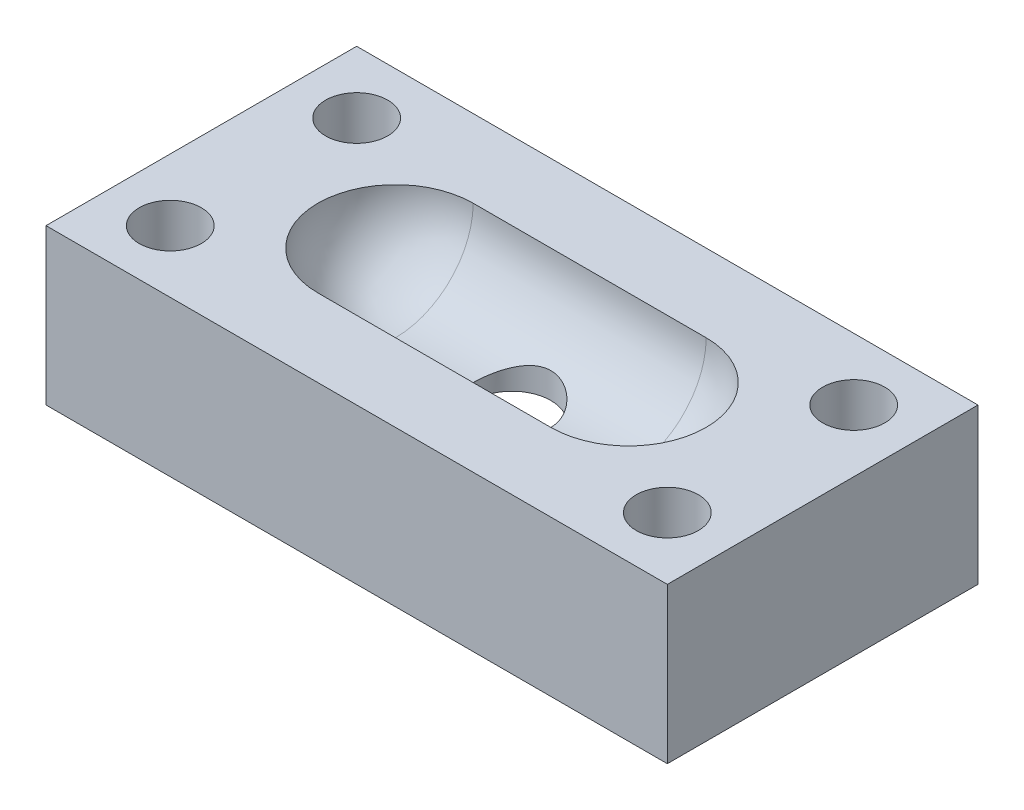
ISO-10303-21;
HEADER;
FILE_DESCRIPTION(('STEP AP214'),'2;1');
FILE_NAME('part.step','',(''),(''),'','','');
FILE_SCHEMA(('AUTOMOTIVE_DESIGN { 1 0 10303 214 1 1 1 1 }'));
ENDSEC;
DATA;
#1=APPLICATION_CONTEXT('core data for automotive mechanical design processes');
#2=APPLICATION_PROTOCOL_DEFINITION('international standard','automotive_design',2000,#1);
#3=PRODUCT_CONTEXT('',#1,'mechanical');
#4=PRODUCT('Part','Part','',(#3));
#5=PRODUCT_RELATED_PRODUCT_CATEGORY('part','',(#4));
#6=PRODUCT_DEFINITION_FORMATION('','',#4);
#7=PRODUCT_DEFINITION_CONTEXT('part definition',#1,'design');
#8=PRODUCT_DEFINITION('design','',#6,#7);
#9=PRODUCT_DEFINITION_SHAPE('','',#8);
#10=(LENGTH_UNIT() NAMED_UNIT(*) SI_UNIT(.MILLI.,.METRE.));
#11=(NAMED_UNIT(*) PLANE_ANGLE_UNIT() SI_UNIT($,.RADIAN.));
#12=(NAMED_UNIT(*) SI_UNIT($,.STERADIAN.) SOLID_ANGLE_UNIT());
#13=UNCERTAINTY_MEASURE_WITH_UNIT(LENGTH_MEASURE(1.E-05),#10,'distance_accuracy_value','');
#14=(GEOMETRIC_REPRESENTATION_CONTEXT(3) GLOBAL_UNCERTAINTY_ASSIGNED_CONTEXT((#13)) GLOBAL_UNIT_ASSIGNED_CONTEXT((#10,
#11,#12)) REPRESENTATION_CONTEXT('',''));
#15=CARTESIAN_POINT('',(0.,0.,0.));
#16=DIRECTION('',(0.,0.,1.));
#17=DIRECTION('',(1.,0.,0.));
#18=AXIS2_PLACEMENT_3D('',#15,#16,#17);
#19=CARTESIAN_POINT('',(0.,5.,0.));
#20=DIRECTION('',(0.,-1.,0.));
#21=DIRECTION('',(0.,0.,-1.));
#22=AXIS2_PLACEMENT_3D('',#19,#20,#21);
#23=CYLINDRICAL_SURFACE('',#22,2.5);
#24=CARTESIAN_POINT('',(0.,0.669872981077805,-2.5));
#25=CARTESIAN_POINT('',(0.130266506876492,0.669860177270082,-2.49998948436432));
#26=CARTESIAN_POINT('',(0.260702720676248,0.663904580344168,-2.48974954513168));
#27=CARTESIAN_POINT('',(0.517568971529232,0.640941229480926,-2.44930840724943));
#28=CARTESIAN_POINT('',(0.64399000405729,0.62391025273977,-2.41906526369544));
#29=CARTESIAN_POINT('',(0.888628945561066,0.581266231283411,-2.3402497699757));
#30=CARTESIAN_POINT('',(1.00688657356221,0.555698886610788,-2.29177485369963));
#31=CARTESIAN_POINT('',(1.23356056309455,0.498933408885443,-2.17816884056414));
#32=CARTESIAN_POINT('',(1.34197639179579,0.467734971241166,-2.11303684262671));
#33=CARTESIAN_POINT('',(1.55576430391692,0.400078264751489,-1.96166634317253));
#34=CARTESIAN_POINT('',(1.66014783448977,0.363398406684223,-1.87413008816917));
#35=CARTESIAN_POINT('',(1.8535209757132,0.290700432725469,-1.68313452122751));
#36=CARTESIAN_POINT('',(1.94250290775495,0.254682654872318,-1.57966731506051));
#37=CARTESIAN_POINT('',(2.10841787648564,0.184463075478651,-1.35122390789082));
#38=CARTESIAN_POINT('',(2.18413441927914,0.150547339359278,-1.22526797235894));
#39=CARTESIAN_POINT('',(2.31285213348386,0.0912310976980652,-0.960392566671144));
#40=CARTESIAN_POINT('',(2.3658676404385,0.0658252204546497,-0.82148134538998));
#41=CARTESIAN_POINT('',(2.44376165316397,0.0279884688493007,-0.54511235977352));
#42=CARTESIAN_POINT('',(2.47037381586513,0.014762994465746,-0.40825447621098));
#43=CARTESIAN_POINT('',(2.50041529671129,-0.000189596139728699,-0.131426571755674));
#44=CARTESIAN_POINT('',(2.50385864199536,-0.00192366961167925,0.00854151460651103));
#45=CARTESIAN_POINT('',(2.48813331506858,0.00592545208594663,0.274581311061967));
#46=CARTESIAN_POINT('',(2.47090496119546,0.0145376026952388,0.400802997942674));
#47=CARTESIAN_POINT('',(2.41779789023985,0.0406438685070626,0.648284429795112));
#48=CARTESIAN_POINT('',(2.38191777755984,0.0581386483403573,0.769543802734628));
#49=CARTESIAN_POINT('',(2.29229358477506,0.100710417808434,1.00577347892408));
#50=CARTESIAN_POINT('',(2.23830921706972,0.125888961769967,1.120633558788));
#51=CARTESIAN_POINT('',(2.11434145949638,0.181558850332876,1.33994200378327));
#52=CARTESIAN_POINT('',(2.04435234174416,0.212052096062912,1.4443866220966));
#53=CARTESIAN_POINT('',(1.88276162116743,0.278890140019253,1.6504341522455));
#54=CARTESIAN_POINT('',(1.78974242918497,0.315515600045618,1.75083518757341));
#55=CARTESIAN_POINT('',(1.58852568767457,0.388641485329714,1.93526092574445));
#56=CARTESIAN_POINT('',(1.48031656931485,0.425141793359282,2.01927302893558));
#57=CARTESIAN_POINT('',(1.24337951893978,0.496396097687884,2.17376333660553));
#58=CARTESIAN_POINT('',(1.11378494236447,0.530892000232312,2.24304328744513));
#59=CARTESIAN_POINT('',(0.842655821602504,0.590613743035605,2.35829778250308));
#60=CARTESIAN_POINT('',(0.701133917456093,0.615849248848317,2.40429664552723));
#61=CARTESIAN_POINT('',(0.421963721793025,0.651384104574142,2.4679505275626));
#62=CARTESIAN_POINT('',(0.284897202391127,0.66270860378759,2.48756280529994));
#63=CARTESIAN_POINT('',(0.00899664620863705,0.672052015959761,2.50379236652857));
#64=CARTESIAN_POINT('',(-0.129836072799497,0.67008032776721,2.50042589328757));
#65=CARTESIAN_POINT('',(-0.389134796446797,0.654141586485379,2.47259010835991));
#66=CARTESIAN_POINT('',(-0.509948627769731,0.641510312333648,2.45046954178116));
#67=CARTESIAN_POINT('',(-0.745919465677486,0.607649461216473,2.38924071158112));
#68=CARTESIAN_POINT('',(-0.861074626866852,0.586417099874153,2.35012694655908));
#69=CARTESIAN_POINT('',(-1.08852832725639,0.536594448008588,2.25411897151217));
#70=CARTESIAN_POINT('',(-1.20044754213256,0.507708918923429,2.19648515923163));
#71=CARTESIAN_POINT('',(-1.4136731788488,0.446097012568749,2.0657176600397));
#72=CARTESIAN_POINT('',(-1.51497410878814,0.413368666121276,1.99257601083123));
#73=CARTESIAN_POINT('',(-1.71744691880332,0.342800038591638,1.82209291799636));
#74=CARTESIAN_POINT('',(-1.81699287677222,0.304835421142924,1.72286318078435));
#75=CARTESIAN_POINT('',(-1.99853059500591,0.231644125552539,1.5085112384988));
#76=CARTESIAN_POINT('',(-2.08051642565855,0.196418374806708,1.39338368664988));
#77=CARTESIAN_POINT('',(-2.22643431479089,0.131465957726656,1.14633840638507));
#78=CARTESIAN_POINT('',(-2.28983279520846,0.10190895820145,1.01405774389062));
#79=CARTESIAN_POINT('',(-2.39284475996202,0.0529161260152968,0.738805911647332));
#80=CARTESIAN_POINT('',(-2.43247912960512,0.0334714080825393,0.595844253647067));
#81=CARTESIAN_POINT('',(-2.48342140935642,0.00831229546032039,0.317449205674706));
#82=CARTESIAN_POINT('',(-2.49699468583034,0.00150180232162231,0.182528609085377));
#83=CARTESIAN_POINT('',(-2.50210816749459,-0.00105325940467168,-0.0878149643374306));
#84=CARTESIAN_POINT('',(-2.49365608566108,0.00319829822958369,-0.223237748727016));
#85=CARTESIAN_POINT('',(-2.45645896960449,0.0216507791436313,-0.481344982671072));
#86=CARTESIAN_POINT('',(-2.42908782836368,0.0351776336319329,-0.604280801321772));
#87=CARTESIAN_POINT('',(-2.35668255024167,0.0701976580826903,-0.843614873664454));
#88=CARTESIAN_POINT('',(-2.31164588036637,0.0916919704448225,-0.960012187087213));
#89=CARTESIAN_POINT('',(-2.20318218126074,0.141851732585117,-1.18855854199593));
#90=CARTESIAN_POINT('',(-2.13905097531015,0.170784574931973,-1.30031295715363));
#91=CARTESIAN_POINT('',(-1.99510588985241,0.232796666550143,-1.51193650408535));
#92=CARTESIAN_POINT('',(-1.91528480737313,0.265877817708955,-1.61180014305397));
#93=CARTESIAN_POINT('',(-1.73300420555064,0.336784764490747,-1.80728542324369));
#94=CARTESIAN_POINT('',(-1.62908227399927,0.374755103416334,-1.90149582349002));
#95=CARTESIAN_POINT('',(-1.40638471461777,0.448423017150589,-2.07165660492503));
#96=CARTESIAN_POINT('',(-1.28759608580077,0.484118560894155,-2.1475908315154));
#97=CARTESIAN_POINT('',(-1.03336388233574,0.550010171760739,-2.28108393396028));
#98=CARTESIAN_POINT('',(-0.897512611575394,0.579996796530162,-2.33798627977449));
#99=CARTESIAN_POINT('',(-0.686777350480224,0.616297273399065,-2.40494911880459));
#100=CARTESIAN_POINT('',(-0.615440224302388,0.626945133539456,-2.42419582683991));
#101=CARTESIAN_POINT('',(-0.470959303150664,0.64492425829065,-2.45635087255788));
#102=CARTESIAN_POINT('',(-0.397816809045582,0.652257841457658,-2.46926364179176));
#103=CARTESIAN_POINT('',(-0.27049901345306,0.661762204570793,-2.48591166201423));
#104=CARTESIAN_POINT('',(-0.216583678487793,0.664795129752089,-2.49118864979202));
#105=CARTESIAN_POINT('',(-0.108455383689593,0.668853250886771,-2.49823512543933));
#106=CARTESIAN_POINT('',(-0.0542424041894476,0.669878312527387,-2.50000437866474));
#107=CARTESIAN_POINT('',(0.,0.669872981077805,-2.5));
#108=B_SPLINE_CURVE_WITH_KNOTS('',3,(#24,#25,#26,#27,#28,#29,#30,#31,#32,#33,#34,#35,#36,#37,
#38,#39,#40,#41,#42,#43,#44,#45,#46,#47,#48,#49,#50,#51,#52,#53,#54,#55,#56,#57,#58,#59,#60,#61,
#62,#63,#64,#65,#66,#67,#68,#69,#70,#71,#72,#73,#74,#75,#76,#77,#78,#79,#80,#81,#82,#83,#84,#85,
#86,#87,#88,#89,#90,#91,#92,#93,#94,#95,#96,#97,#98,#99,#100,#101,#102,#103,#104,#105,#106,
#107),.UNSPECIFIED.,.T.,.F.,(4,2,2,2,2,2,2,2,2,2,2,2,2,2,2,2,2,2,2,2,2,2,2,2,2,2,2,2,2,2,2,2,2,
2,2,2,2,2,2,2,2,4),(0.,0.390580306486789,0.781982232062012,1.17132148982692,1.56068181366371,
1.98215578129642,2.40383927716011,2.85394730601992,3.30377067414811,3.72158712424921,
4.13915059220183,4.52040243716429,4.90168281298721,5.2882383683295,5.67493248380763,
6.0981797864731,6.5217512061988,6.97222104328704,7.42221935534346,7.83655727140613,
8.25060232976016,8.61935458565147,8.98822631095241,9.37418241020302,9.76033715555202,
10.1951685895662,10.6301466245059,11.076604535375,11.5226694952701,11.927806759788,
12.3328021699001,12.7111106218381,13.0894733378512,13.4840187680376,13.8787457525688,
14.3127560463025,14.7471485711797,15.195268726016,15.4189244153949,15.6424233996907,
15.8050484542806,15.9676843870379),.UNSPECIFIED.);
#109=CARTESIAN_POINT('',(0.,0.669872981077805,-2.5));
#110=VERTEX_POINT('',#109);
#111=EDGE_CURVE('E171',#110,#110,#108,.T.);
#112=ORIENTED_EDGE('',*,*,#111,.F.);
#113=EDGE_LOOP('',(#112));
#114=FACE_BOUND('',#113,.T.);
#115=CARTESIAN_POINT('',(0.,-1.,0.));
#116=DIRECTION('',(0.,-1.,0.));
#117=DIRECTION('',(0.,0.,-1.));
#118=AXIS2_PLACEMENT_3D('',#115,#116,#117);
#119=CIRCLE('',#118,2.5);
#120=CARTESIAN_POINT('',(0.,-1.,-2.5));
#121=VERTEX_POINT('',#120);
#122=EDGE_CURVE('E159',#121,#121,#119,.T.);
#123=ORIENTED_EDGE('',*,*,#122,.T.);
#124=EDGE_LOOP('',(#123));
#125=FACE_BOUND('',#124,.T.);
#126=ADVANCED_FACE('F38',(#114,#125),#23,.F.);
#127=CARTESIAN_POINT('',(0.,5.,0.));
#128=DIRECTION('',(0.,-1.,0.));
#129=DIRECTION('',(0.,0.,-1.));
#130=AXIS2_PLACEMENT_3D('',#127,#128,#129);
#131=PLANE('',#130);
#132=DIRECTION('',(-1.,0.,0.));
#133=VECTOR('',#132,1.);
#134=CARTESIAN_POINT('',(-12.5,5.,5.));
#135=LINE('',#134,#133);
#136=CARTESIAN_POINT('',(7.5,5.,5.));
#137=VERTEX_POINT('',#136);
#138=CARTESIAN_POINT('',(-7.5,5.,5.));
#139=VERTEX_POINT('',#138);
#140=EDGE_CURVE('E176',#137,#139,#135,.T.);
#141=ORIENTED_EDGE('',*,*,#140,.T.);
#142=CARTESIAN_POINT('',(-7.5,5.,0.));
#143=DIRECTION('',(0.,-1.,0.));
#144=DIRECTION('',(0.,0.,-1.));
#145=AXIS2_PLACEMENT_3D('',#142,#143,#144);
#146=CIRCLE('',#145,5.);
#147=CARTESIAN_POINT('',(-7.5,5.,-5.));
#148=VERTEX_POINT('',#147);
#149=EDGE_CURVE('E435',#139,#148,#146,.T.);
#150=ORIENTED_EDGE('',*,*,#149,.T.);
#151=DIRECTION('',(-1.,0.,0.));
#152=VECTOR('',#151,1.);
#153=CARTESIAN_POINT('',(-12.5,5.,-5.));
#154=LINE('',#153,#152);
#155=CARTESIAN_POINT('',(7.5,5.,-5.));
#156=VERTEX_POINT('',#155);
#157=EDGE_CURVE('E172',#148,#156,#154,.F.);
#158=ORIENTED_EDGE('',*,*,#157,.T.);
#159=CARTESIAN_POINT('',(7.5,5.,0.));
#160=DIRECTION('',(0.,-1.,0.));
#161=DIRECTION('',(0.,0.,-1.));
#162=AXIS2_PLACEMENT_3D('',#159,#160,#161);
#163=CIRCLE('',#162,5.);
#164=EDGE_CURVE('E238',#156,#137,#163,.T.);
#165=ORIENTED_EDGE('',*,*,#164,.T.);
#166=EDGE_LOOP('',(#141,#150,#158,#165));
#167=FACE_BOUND('',#166,.T.);
#168=DIRECTION('',(0.,0.,-1.));
#169=VECTOR('',#168,1.);
#170=CARTESIAN_POINT('',(20.,5.,10.));
#171=LINE('',#170,#169);
#172=CARTESIAN_POINT('',(20.,5.,10.));
#173=VERTEX_POINT('',#172);
#174=CARTESIAN_POINT('',(20.,5.,-10.));
#175=VERTEX_POINT('',#174);
#176=EDGE_CURVE('E197',#173,#175,#171,.T.);
#177=ORIENTED_EDGE('',*,*,#176,.T.);
#178=DIRECTION('',(-1.,0.,0.));
#179=VECTOR('',#178,1.);
#180=CARTESIAN_POINT('',(-20.,5.,-10.));
#181=LINE('',#180,#179);
#182=CARTESIAN_POINT('',(-20.,5.,-10.));
#183=VERTEX_POINT('',#182);
#184=EDGE_CURVE('E201',#175,#183,#181,.T.);
#185=ORIENTED_EDGE('',*,*,#184,.T.);
#186=DIRECTION('',(0.,0.,1.));
#187=VECTOR('',#186,1.);
#188=CARTESIAN_POINT('',(-20.,5.,10.));
#189=LINE('',#188,#187);
#190=CARTESIAN_POINT('',(-20.,5.,10.));
#191=VERTEX_POINT('',#190);
#192=EDGE_CURVE('E205',#183,#191,#189,.T.);
#193=ORIENTED_EDGE('',*,*,#192,.T.);
#194=DIRECTION('',(1.,0.,0.));
#195=VECTOR('',#194,1.);
#196=CARTESIAN_POINT('',(-20.,5.,10.));
#197=LINE('',#196,#195);
#198=EDGE_CURVE('E208',#191,#173,#197,.T.);
#199=ORIENTED_EDGE('',*,*,#198,.T.);
#200=EDGE_LOOP('',(#177,#185,#193,#199));
#201=FACE_BOUND('',#200,.T.);
#202=CARTESIAN_POINT('',(-16.,5.,-6.));
#203=DIRECTION('',(0.,1.,0.));
#204=DIRECTION('',(0.,0.,1.));
#205=AXIS2_PLACEMENT_3D('',#202,#203,#204);
#206=CIRCLE('',#205,2.);
#207=CARTESIAN_POINT('',(-16.,5.,-4.));
#208=VERTEX_POINT('',#207);
#209=EDGE_CURVE('E192',#208,#208,#206,.T.);
#210=ORIENTED_EDGE('',*,*,#209,.F.);
#211=EDGE_LOOP('',(#210));
#212=FACE_BOUND('',#211,.T.);
#213=CARTESIAN_POINT('',(16.,5.,-6.));
#214=DIRECTION('',(0.,1.,0.));
#215=DIRECTION('',(0.,0.,1.));
#216=AXIS2_PLACEMENT_3D('',#213,#214,#215);
#217=CIRCLE('',#216,2.);
#218=CARTESIAN_POINT('',(16.,5.,-4.));
#219=VERTEX_POINT('',#218);
#220=EDGE_CURVE('E188',#219,#219,#217,.T.);
#221=ORIENTED_EDGE('',*,*,#220,.F.);
#222=EDGE_LOOP('',(#221));
#223=FACE_BOUND('',#222,.T.);
#224=CARTESIAN_POINT('',(16.,5.,6.));
#225=DIRECTION('',(0.,1.,0.));
#226=DIRECTION('',(0.,0.,1.));
#227=AXIS2_PLACEMENT_3D('',#224,#225,#226);
#228=CIRCLE('',#227,2.);
#229=CARTESIAN_POINT('',(16.,5.,8.));
#230=VERTEX_POINT('',#229);
#231=EDGE_CURVE('E184',#230,#230,#228,.T.);
#232=ORIENTED_EDGE('',*,*,#231,.F.);
#233=EDGE_LOOP('',(#232));
#234=FACE_BOUND('',#233,.T.);
#235=CARTESIAN_POINT('',(-16.,5.,6.));
#236=DIRECTION('',(0.,1.,0.));
#237=DIRECTION('',(0.,0.,1.));
#238=AXIS2_PLACEMENT_3D('',#235,#236,#237);
#239=CIRCLE('',#238,2.);
#240=CARTESIAN_POINT('',(-16.,5.,8.));
#241=VERTEX_POINT('',#240);
#242=EDGE_CURVE('E180',#241,#241,#239,.T.);
#243=ORIENTED_EDGE('',*,*,#242,.F.);
#244=EDGE_LOOP('',(#243));
#245=FACE_BOUND('',#244,.T.);
#246=ADVANCED_FACE('F272',(#167,#201,#212,#223,#234,#245),#131,.F.);
#247=CARTESIAN_POINT('',(0.,-5.,0.));
#248=DIRECTION('',(0.,-1.,0.));
#249=DIRECTION('',(0.,0.,-1.));
#250=AXIS2_PLACEMENT_3D('',#247,#248,#249);
#251=PLANE('',#250);
#252=CARTESIAN_POINT('',(-5.60769515458673,-5.,0.));
#253=DIRECTION('',(0.,-1.,0.));
#254=DIRECTION('',(0.,0.,-1.));
#255=AXIS2_PLACEMENT_3D('',#252,#253,#254);
#256=CIRCLE('',#255,7.);
#257=CARTESIAN_POINT('',(-5.60769515458673,-5.,7.));
#258=VERTEX_POINT('',#257);
#259=CARTESIAN_POINT('',(-5.60769515458673,-5.,-7.));
#260=VERTEX_POINT('',#259);
#261=EDGE_CURVE('E144',#258,#260,#256,.T.);
#262=ORIENTED_EDGE('',*,*,#261,.F.);
#263=DIRECTION('',(-1.,0.,0.));
#264=VECTOR('',#263,1.);
#265=CARTESIAN_POINT('',(-5.60769515458673,-5.,7.));
#266=LINE('',#265,#264);
#267=CARTESIAN_POINT('',(5.60769515458673,-5.,7.));
#268=VERTEX_POINT('',#267);
#269=EDGE_CURVE('E149',#268,#258,#266,.T.);
#270=ORIENTED_EDGE('',*,*,#269,.F.);
#271=CARTESIAN_POINT('',(5.60769515458673,-5.,0.));
#272=DIRECTION('',(0.,-1.,0.));
#273=DIRECTION('',(0.,0.,-1.));
#274=AXIS2_PLACEMENT_3D('',#271,#272,#273);
#275=CIRCLE('',#274,7.);
#276=CARTESIAN_POINT('',(5.60769515458673,-5.,-7.));
#277=VERTEX_POINT('',#276);
#278=EDGE_CURVE('E131',#277,#268,#275,.T.);
#279=ORIENTED_EDGE('',*,*,#278,.F.);
#280=DIRECTION('',(1.,0.,0.));
#281=VECTOR('',#280,1.);
#282=CARTESIAN_POINT('',(-5.60769515458673,-5.,-7.));
#283=LINE('',#282,#281);
#284=EDGE_CURVE('E138',#260,#277,#283,.T.);
#285=ORIENTED_EDGE('',*,*,#284,.F.);
#286=EDGE_LOOP('',(#262,#270,#279,#285));
#287=FACE_BOUND('',#286,.T.);
#288=CARTESIAN_POINT('',(16.,-5.,6.));
#289=DIRECTION('',(0.,-1.,0.));
#290=DIRECTION('',(0.,0.,-1.));
#291=AXIS2_PLACEMENT_3D('',#288,#289,#290);
#292=CIRCLE('',#291,3.);
#293=CARTESIAN_POINT('',(16.,-5.,3.));
#294=VERTEX_POINT('',#293);
#295=EDGE_CURVE('E411',#294,#294,#292,.F.);
#296=ORIENTED_EDGE('',*,*,#295,.T.);
#297=EDGE_LOOP('',(#296));
#298=FACE_BOUND('',#297,.T.);
#299=CARTESIAN_POINT('',(16.,-5.,-6.));
#300=DIRECTION('',(0.,-1.,0.));
#301=DIRECTION('',(0.,0.,-1.));
#302=AXIS2_PLACEMENT_3D('',#299,#300,#301);
#303=CIRCLE('',#302,3.);
#304=CARTESIAN_POINT('',(16.,-5.,-9.));
#305=VERTEX_POINT('',#304);
#306=EDGE_CURVE('E419',#305,#305,#303,.F.);
#307=ORIENTED_EDGE('',*,*,#306,.T.);
#308=EDGE_LOOP('',(#307));
#309=FACE_BOUND('',#308,.T.);
#310=CARTESIAN_POINT('',(-16.,-5.,-6.));
#311=DIRECTION('',(0.,-1.,0.));
#312=DIRECTION('',(0.,0.,-1.));
#313=AXIS2_PLACEMENT_3D('',#310,#311,#312);
#314=CIRCLE('',#313,3.);
#315=CARTESIAN_POINT('',(-16.,-5.,-9.));
#316=VERTEX_POINT('',#315);
#317=EDGE_CURVE('E434',#316,#316,#314,.F.);
#318=ORIENTED_EDGE('',*,*,#317,.T.);
#319=EDGE_LOOP('',(#318));
#320=FACE_BOUND('',#319,.T.);
#321=CARTESIAN_POINT('',(-16.,-5.,6.));
#322=DIRECTION('',(0.,-1.,0.));
#323=DIRECTION('',(0.,0.,-1.));
#324=AXIS2_PLACEMENT_3D('',#321,#322,#323);
#325=CIRCLE('',#324,3.);
#326=CARTESIAN_POINT('',(-16.,-5.,3.));
#327=VERTEX_POINT('',#326);
#328=EDGE_CURVE('E431',#327,#327,#325,.F.);
#329=ORIENTED_EDGE('',*,*,#328,.T.);
#330=EDGE_LOOP('',(#329));
#331=FACE_BOUND('',#330,.T.);
#332=DIRECTION('',(0.,0.,-1.));
#333=VECTOR('',#332,1.);
#334=CARTESIAN_POINT('',(20.,-5.,10.));
#335=LINE('',#334,#333);
#336=CARTESIAN_POINT('',(20.,-5.,10.));
#337=VERTEX_POINT('',#336);
#338=CARTESIAN_POINT('',(20.,-5.,-10.));
#339=VERTEX_POINT('',#338);
#340=EDGE_CURVE('E196',#337,#339,#335,.T.);
#341=ORIENTED_EDGE('',*,*,#340,.F.);
#342=DIRECTION('',(1.,0.,0.));
#343=VECTOR('',#342,1.);
#344=CARTESIAN_POINT('',(-20.,-5.,10.));
#345=LINE('',#344,#343);
#346=CARTESIAN_POINT('',(-20.,-5.,10.));
#347=VERTEX_POINT('',#346);
#348=EDGE_CURVE('E202',#347,#337,#345,.T.);
#349=ORIENTED_EDGE('',*,*,#348,.F.);
#350=DIRECTION('',(0.,0.,1.));
#351=VECTOR('',#350,1.);
#352=CARTESIAN_POINT('',(-20.,-5.,10.));
#353=LINE('',#352,#351);
#354=CARTESIAN_POINT('',(-20.,-5.,-10.));
#355=VERTEX_POINT('',#354);
#356=EDGE_CURVE('E218',#355,#347,#353,.T.);
#357=ORIENTED_EDGE('',*,*,#356,.F.);
#358=DIRECTION('',(-1.,0.,0.));
#359=VECTOR('',#358,1.);
#360=CARTESIAN_POINT('',(-20.,-5.,-10.));
#361=LINE('',#360,#359);
#362=EDGE_CURVE('E215',#339,#355,#361,.T.);
#363=ORIENTED_EDGE('',*,*,#362,.F.);
#364=EDGE_LOOP('',(#341,#349,#357,#363));
#365=FACE_BOUND('',#364,.T.);
#366=ADVANCED_FACE('F146',(#287,#298,#309,#320,#331,#365),#251,.T.);
#367=CARTESIAN_POINT('',(20.,5.,10.));
#368=DIRECTION('',(-1.,0.,0.));
#369=DIRECTION('',(0.,0.,1.));
#370=AXIS2_PLACEMENT_3D('',#367,#368,#369);
#371=PLANE('',#370);
#372=ORIENTED_EDGE('',*,*,#340,.T.);
#373=DIRECTION('',(0.,-1.,0.));
#374=VECTOR('',#373,1.);
#375=CARTESIAN_POINT('',(20.,5.,-10.));
#376=LINE('',#375,#374);
#377=EDGE_CURVE('E234',#175,#339,#376,.T.);
#378=ORIENTED_EDGE('',*,*,#377,.F.);
#379=ORIENTED_EDGE('',*,*,#176,.F.);
#380=DIRECTION('',(0.,-1.,0.));
#381=VECTOR('',#380,1.);
#382=CARTESIAN_POINT('',(20.,5.,10.));
#383=LINE('',#382,#381);
#384=EDGE_CURVE('E211',#173,#337,#383,.T.);
#385=ORIENTED_EDGE('',*,*,#384,.T.);
#386=EDGE_LOOP('',(#372,#378,#379,#385));
#387=FACE_BOUND('',#386,.T.);
#388=ADVANCED_FACE('F370',(#387),#371,.F.);
#389=CARTESIAN_POINT('',(-20.,5.,-10.));
#390=DIRECTION('',(0.,0.,1.));
#391=DIRECTION('',(1.,0.,0.));
#392=AXIS2_PLACEMENT_3D('',#389,#390,#391);
#393=PLANE('',#392);
#394=ORIENTED_EDGE('',*,*,#362,.T.);
#395=DIRECTION('',(0.,-1.,0.));
#396=VECTOR('',#395,1.);
#397=CARTESIAN_POINT('',(-20.,5.,-10.));
#398=LINE('',#397,#396);
#399=EDGE_CURVE('E230',#183,#355,#398,.T.);
#400=ORIENTED_EDGE('',*,*,#399,.F.);
#401=ORIENTED_EDGE('',*,*,#184,.F.);
#402=ORIENTED_EDGE('',*,*,#377,.T.);
#403=EDGE_LOOP('',(#394,#400,#401,#402));
#404=FACE_BOUND('',#403,.T.);
#405=ADVANCED_FACE('F373',(#404),#393,.F.);
#406=CARTESIAN_POINT('',(-20.,5.,10.));
#407=DIRECTION('',(1.,0.,0.));
#408=DIRECTION('',(0.,0.,-1.));
#409=AXIS2_PLACEMENT_3D('',#406,#407,#408);
#410=PLANE('',#409);
#411=ORIENTED_EDGE('',*,*,#356,.T.);
#412=DIRECTION('',(0.,-1.,0.));
#413=VECTOR('',#412,1.);
#414=CARTESIAN_POINT('',(-20.,5.,10.));
#415=LINE('',#414,#413);
#416=EDGE_CURVE('E226',#191,#347,#415,.T.);
#417=ORIENTED_EDGE('',*,*,#416,.F.);
#418=ORIENTED_EDGE('',*,*,#192,.F.);
#419=ORIENTED_EDGE('',*,*,#399,.T.);
#420=EDGE_LOOP('',(#411,#417,#418,#419));
#421=FACE_BOUND('',#420,.T.);
#422=ADVANCED_FACE('F377',(#421),#410,.F.);
#423=CARTESIAN_POINT('',(-20.,5.,10.));
#424=DIRECTION('',(0.,0.,-1.));
#425=DIRECTION('',(-1.,0.,0.));
#426=AXIS2_PLACEMENT_3D('',#423,#424,#425);
#427=PLANE('',#426);
#428=ORIENTED_EDGE('',*,*,#348,.T.);
#429=ORIENTED_EDGE('',*,*,#384,.F.);
#430=ORIENTED_EDGE('',*,*,#198,.F.);
#431=ORIENTED_EDGE('',*,*,#416,.T.);
#432=EDGE_LOOP('',(#428,#429,#430,#431));
#433=FACE_BOUND('',#432,.T.);
#434=ADVANCED_FACE('F381',(#433),#427,.F.);
#435=CARTESIAN_POINT('',(-16.,5.,-6.));
#436=DIRECTION('',(0.,-1.,0.));
#437=DIRECTION('',(0.,0.,-1.));
#438=AXIS2_PLACEMENT_3D('',#435,#436,#437);
#439=CYLINDRICAL_SURFACE('',#438,2.);
#440=CARTESIAN_POINT('',(-16.,-3.99999999999999,-6.));
#441=DIRECTION('',(0.,-1.,0.));
#442=DIRECTION('',(0.,0.,-1.));
#443=AXIS2_PLACEMENT_3D('',#440,#441,#442);
#444=CIRCLE('',#443,2.);
#445=CARTESIAN_POINT('',(-16.,-3.99999999999999,-8.));
#446=VERTEX_POINT('',#445);
#447=EDGE_CURVE('E416',#446,#446,#444,.T.);
#448=ORIENTED_EDGE('',*,*,#447,.T.);
#449=EDGE_LOOP('',(#448));
#450=FACE_BOUND('',#449,.T.);
#451=ORIENTED_EDGE('',*,*,#209,.T.);
#452=EDGE_LOOP('',(#451));
#453=FACE_BOUND('',#452,.T.);
#454=ADVANCED_FACE('F385',(#450,#453),#439,.F.);
#455=CARTESIAN_POINT('',(16.,5.,-6.));
#456=DIRECTION('',(0.,-1.,0.));
#457=DIRECTION('',(0.,0.,-1.));
#458=AXIS2_PLACEMENT_3D('',#455,#456,#457);
#459=CYLINDRICAL_SURFACE('',#458,2.);
#460=CARTESIAN_POINT('',(16.,-3.99999999999999,-6.));
#461=DIRECTION('',(0.,-1.,0.));
#462=DIRECTION('',(0.,0.,-1.));
#463=AXIS2_PLACEMENT_3D('',#460,#461,#462);
#464=CIRCLE('',#463,2.);
#465=CARTESIAN_POINT('',(16.,-3.99999999999999,-8.));
#466=VERTEX_POINT('',#465);
#467=EDGE_CURVE('E410',#466,#466,#464,.T.);
#468=ORIENTED_EDGE('',*,*,#467,.T.);
#469=EDGE_LOOP('',(#468));
#470=FACE_BOUND('',#469,.T.);
#471=ORIENTED_EDGE('',*,*,#220,.T.);
#472=EDGE_LOOP('',(#471));
#473=FACE_BOUND('',#472,.T.);
#474=ADVANCED_FACE('F391',(#470,#473),#459,.F.);
#475=CARTESIAN_POINT('',(16.,5.,6.));
#476=DIRECTION('',(0.,-1.,0.));
#477=DIRECTION('',(0.,0.,-1.));
#478=AXIS2_PLACEMENT_3D('',#475,#476,#477);
#479=CYLINDRICAL_SURFACE('',#478,2.);
#480=CARTESIAN_POINT('',(16.,-3.99999999999999,6.));
#481=DIRECTION('',(0.,-1.,0.));
#482=DIRECTION('',(0.,0.,-1.));
#483=AXIS2_PLACEMENT_3D('',#480,#481,#482);
#484=CIRCLE('',#483,2.);
#485=CARTESIAN_POINT('',(16.,-3.99999999999999,4.));
#486=VERTEX_POINT('',#485);
#487=EDGE_CURVE('E403',#486,#486,#484,.T.);
#488=ORIENTED_EDGE('',*,*,#487,.T.);
#489=EDGE_LOOP('',(#488));
#490=FACE_BOUND('',#489,.T.);
#491=ORIENTED_EDGE('',*,*,#231,.T.);
#492=EDGE_LOOP('',(#491));
#493=FACE_BOUND('',#492,.T.);
#494=ADVANCED_FACE('F268',(#490,#493),#479,.F.);
#495=CARTESIAN_POINT('',(-16.,5.,6.));
#496=DIRECTION('',(0.,-1.,0.));
#497=DIRECTION('',(0.,0.,-1.));
#498=AXIS2_PLACEMENT_3D('',#495,#496,#497);
#499=CYLINDRICAL_SURFACE('',#498,2.);
#500=CARTESIAN_POINT('',(-16.,-3.99999999999999,6.));
#501=DIRECTION('',(0.,-1.,0.));
#502=DIRECTION('',(0.,0.,-1.));
#503=AXIS2_PLACEMENT_3D('',#500,#501,#502);
#504=CIRCLE('',#503,2.);
#505=CARTESIAN_POINT('',(-16.,-3.99999999999999,4.));
#506=VERTEX_POINT('',#505);
#507=EDGE_CURVE('E288',#506,#506,#504,.T.);
#508=ORIENTED_EDGE('',*,*,#507,.T.);
#509=EDGE_LOOP('',(#508));
#510=FACE_BOUND('',#509,.T.);
#511=ORIENTED_EDGE('',*,*,#242,.T.);
#512=EDGE_LOOP('',(#511));
#513=FACE_BOUND('',#512,.T.);
#514=ADVANCED_FACE('F261',(#510,#513),#499,.F.);
#515=CARTESIAN_POINT('',(-7.5,5.,0.));
#516=DIRECTION('',(-1.,0.,0.));
#517=DIRECTION('',(0.,1.,0.));
#518=AXIS2_PLACEMENT_3D('',#515,#516,#517);
#519=SPHERICAL_SURFACE('',#518,5.);
#520=CARTESIAN_POINT('',(-7.5,5.,0.));
#521=DIRECTION('',(-1.,0.,0.));
#522=DIRECTION('',(0.,0.,1.));
#523=AXIS2_PLACEMENT_3D('',#520,#521,#522);
#524=CIRCLE('',#523,5.);
#525=EDGE_CURVE('E167',#148,#139,#524,.T.);
#526=ORIENTED_EDGE('',*,*,#525,.F.);
#527=ORIENTED_EDGE('',*,*,#149,.F.);
#528=EDGE_LOOP('',(#526,#527));
#529=FACE_BOUND('',#528,.T.);
#530=ADVANCED_FACE('F259',(#529),#519,.F.);
#531=CARTESIAN_POINT('',(7.5,5.,0.));
#532=DIRECTION('',(-1.,0.,0.));
#533=DIRECTION('',(0.,-1.,0.));
#534=AXIS2_PLACEMENT_3D('',#531,#532,#533);
#535=SPHERICAL_SURFACE('',#534,5.);
#536=CARTESIAN_POINT('',(7.5,5.,0.));
#537=DIRECTION('',(-1.,0.,0.));
#538=DIRECTION('',(0.,0.,1.));
#539=AXIS2_PLACEMENT_3D('',#536,#537,#538);
#540=CIRCLE('',#539,5.);
#541=EDGE_CURVE('E164',#156,#137,#540,.T.);
#542=ORIENTED_EDGE('',*,*,#541,.T.);
#543=ORIENTED_EDGE('',*,*,#164,.F.);
#544=EDGE_LOOP('',(#542,#543));
#545=FACE_BOUND('',#544,.T.);
#546=ADVANCED_FACE('F256',(#545),#535,.F.);
#547=CARTESIAN_POINT('',(-12.5,5.,0.));
#548=DIRECTION('',(-1.,0.,0.));
#549=DIRECTION('',(0.,0.,1.));
#550=AXIS2_PLACEMENT_3D('',#547,#548,#549);
#551=CYLINDRICAL_SURFACE('',#550,5.);
#552=ORIENTED_EDGE('',*,*,#111,.T.);
#553=EDGE_LOOP('',(#552));
#554=FACE_BOUND('',#553,.T.);
#555=ORIENTED_EDGE('',*,*,#541,.F.);
#556=ORIENTED_EDGE('',*,*,#157,.F.);
#557=ORIENTED_EDGE('',*,*,#525,.T.);
#558=ORIENTED_EDGE('',*,*,#140,.F.);
#559=EDGE_LOOP('',(#555,#556,#557,#558));
#560=FACE_BOUND('',#559,.T.);
#561=ADVANCED_FACE('F251',(#554,#560),#551,.F.);
#562=CARTESIAN_POINT('',(16.,-5.,6.));
#563=DIRECTION('',(0.,-1.,0.));
#564=DIRECTION('',(0.,0.,-1.));
#565=AXIS2_PLACEMENT_3D('',#562,#563,#564);
#566=CONICAL_SURFACE('',#565,3.,0.785398163397445);
#567=ORIENTED_EDGE('',*,*,#487,.F.);
#568=EDGE_LOOP('',(#567));
#569=FACE_BOUND('',#568,.T.);
#570=ORIENTED_EDGE('',*,*,#295,.F.);
#571=EDGE_LOOP('',(#570));
#572=FACE_BOUND('',#571,.T.);
#573=ADVANCED_FACE('F255',(#569,#572),#566,.F.);
#574=CARTESIAN_POINT('',(16.,-5.,-6.));
#575=DIRECTION('',(0.,-1.,0.));
#576=DIRECTION('',(0.,0.,-1.));
#577=AXIS2_PLACEMENT_3D('',#574,#575,#576);
#578=CONICAL_SURFACE('',#577,3.,0.785398163397445);
#579=ORIENTED_EDGE('',*,*,#467,.F.);
#580=EDGE_LOOP('',(#579));
#581=FACE_BOUND('',#580,.T.);
#582=ORIENTED_EDGE('',*,*,#306,.F.);
#583=EDGE_LOOP('',(#582));
#584=FACE_BOUND('',#583,.T.);
#585=ADVANCED_FACE('F362',(#581,#584),#578,.F.);
#586=CARTESIAN_POINT('',(-16.,-5.,-6.));
#587=DIRECTION('',(0.,-1.,0.));
#588=DIRECTION('',(0.,0.,-1.));
#589=AXIS2_PLACEMENT_3D('',#586,#587,#588);
#590=CONICAL_SURFACE('',#589,3.,0.785398163397445);
#591=ORIENTED_EDGE('',*,*,#447,.F.);
#592=EDGE_LOOP('',(#591));
#593=FACE_BOUND('',#592,.T.);
#594=ORIENTED_EDGE('',*,*,#317,.F.);
#595=EDGE_LOOP('',(#594));
#596=FACE_BOUND('',#595,.T.);
#597=ADVANCED_FACE('F358',(#593,#596),#590,.F.);
#598=CARTESIAN_POINT('',(-16.,-5.,6.));
#599=DIRECTION('',(0.,-1.,0.));
#600=DIRECTION('',(0.,0.,-1.));
#601=AXIS2_PLACEMENT_3D('',#598,#599,#600);
#602=CONICAL_SURFACE('',#601,3.,0.785398163397445);
#603=ORIENTED_EDGE('',*,*,#507,.F.);
#604=EDGE_LOOP('',(#603));
#605=FACE_BOUND('',#604,.T.);
#606=ORIENTED_EDGE('',*,*,#328,.F.);
#607=EDGE_LOOP('',(#606));
#608=FACE_BOUND('',#607,.T.);
#609=ADVANCED_FACE('F355',(#605,#608),#602,.F.);
#610=CARTESIAN_POINT('',(-5.60769515458673,-1.,0.));
#611=DIRECTION('',(0.,-1.,0.));
#612=DIRECTION('',(0.,0.,-1.));
#613=AXIS2_PLACEMENT_3D('',#610,#611,#612);
#614=CYLINDRICAL_SURFACE('',#613,7.);
#615=DIRECTION('',(0.,-1.,0.));
#616=VECTOR('',#615,1.);
#617=CARTESIAN_POINT('',(-5.60769515458673,-1.,-7.));
#618=LINE('',#617,#616);
#619=CARTESIAN_POINT('',(-5.60769515458673,-3.,-7.));
#620=VERTEX_POINT('',#619);
#621=EDGE_CURVE('E135',#620,#260,#618,.T.);
#622=ORIENTED_EDGE('',*,*,#621,.F.);
#623=CARTESIAN_POINT('',(-5.60769515458673,-3.,0.));
#624=DIRECTION('',(0.,-1.,0.));
#625=DIRECTION('',(0.,0.,-1.));
#626=AXIS2_PLACEMENT_3D('',#623,#624,#625);
#627=CIRCLE('',#626,7.);
#628=CARTESIAN_POINT('',(-5.60769515458673,-3.,7.));
#629=VERTEX_POINT('',#628);
#630=EDGE_CURVE('E11',#620,#629,#627,.F.);
#631=ORIENTED_EDGE('',*,*,#630,.T.);
#632=DIRECTION('',(0.,-1.,0.));
#633=VECTOR('',#632,1.);
#634=CARTESIAN_POINT('',(-5.60769515458673,-1.,7.));
#635=LINE('',#634,#633);
#636=EDGE_CURVE('E156',#629,#258,#635,.T.);
#637=ORIENTED_EDGE('',*,*,#636,.T.);
#638=ORIENTED_EDGE('',*,*,#261,.T.);
#639=EDGE_LOOP('',(#622,#631,#637,#638));
#640=FACE_BOUND('',#639,.T.);
#641=ADVANCED_FACE('F330',(#640),#614,.F.);
#642=CARTESIAN_POINT('',(-5.60769515458673,-1.,7.));
#643=DIRECTION('',(0.,0.,1.));
#644=DIRECTION('',(1.,0.,0.));
#645=AXIS2_PLACEMENT_3D('',#642,#643,#644);
#646=PLANE('',#645);
#647=ORIENTED_EDGE('',*,*,#636,.F.);
#648=DIRECTION('',(-1.,0.,0.));
#649=VECTOR('',#648,1.);
#650=CARTESIAN_POINT('',(-5.60769515458673,-3.,7.));
#651=LINE('',#650,#649);
#652=CARTESIAN_POINT('',(5.60769515458673,-3.,7.));
#653=VERTEX_POINT('',#652);
#654=EDGE_CURVE('E303',#629,#653,#651,.F.);
#655=ORIENTED_EDGE('',*,*,#654,.T.);
#656=DIRECTION('',(0.,-1.,0.));
#657=VECTOR('',#656,1.);
#658=CARTESIAN_POINT('',(5.60769515458673,-1.,7.));
#659=LINE('',#658,#657);
#660=EDGE_CURVE('E134',#653,#268,#659,.T.);
#661=ORIENTED_EDGE('',*,*,#660,.T.);
#662=ORIENTED_EDGE('',*,*,#269,.T.);
#663=EDGE_LOOP('',(#647,#655,#661,#662));
#664=FACE_BOUND('',#663,.T.);
#665=ADVANCED_FACE('F334',(#664),#646,.F.);
#666=CARTESIAN_POINT('',(5.60769515458673,-1.,0.));
#667=DIRECTION('',(0.,-1.,0.));
#668=DIRECTION('',(0.,0.,-1.));
#669=AXIS2_PLACEMENT_3D('',#666,#667,#668);
#670=CYLINDRICAL_SURFACE('',#669,7.);
#671=ORIENTED_EDGE('',*,*,#660,.F.);
#672=CARTESIAN_POINT('',(5.60769515458673,-3.,0.));
#673=DIRECTION('',(0.,-1.,0.));
#674=DIRECTION('',(0.,0.,-1.));
#675=AXIS2_PLACEMENT_3D('',#672,#673,#674);
#676=CIRCLE('',#675,7.);
#677=CARTESIAN_POINT('',(5.60769515458673,-3.,-7.));
#678=VERTEX_POINT('',#677);
#679=EDGE_CURVE('E63',#653,#678,#676,.F.);
#680=ORIENTED_EDGE('',*,*,#679,.T.);
#681=DIRECTION('',(0.,-1.,0.));
#682=VECTOR('',#681,1.);
#683=CARTESIAN_POINT('',(5.60769515458673,-1.,-7.));
#684=LINE('',#683,#682);
#685=EDGE_CURVE('E127',#678,#277,#684,.T.);
#686=ORIENTED_EDGE('',*,*,#685,.T.);
#687=ORIENTED_EDGE('',*,*,#278,.T.);
#688=EDGE_LOOP('',(#671,#680,#686,#687));
#689=FACE_BOUND('',#688,.T.);
#690=ADVANCED_FACE('F129',(#689),#670,.F.);
#691=CARTESIAN_POINT('',(-5.60769515458673,-1.,-7.));
#692=DIRECTION('',(0.,0.,-1.));
#693=DIRECTION('',(-1.,0.,0.));
#694=AXIS2_PLACEMENT_3D('',#691,#692,#693);
#695=PLANE('',#694);
#696=ORIENTED_EDGE('',*,*,#685,.F.);
#697=DIRECTION('',(1.,0.,0.));
#698=VECTOR('',#697,1.);
#699=CARTESIAN_POINT('',(-5.60769515458673,-3.,-7.));
#700=LINE('',#699,#698);
#701=EDGE_CURVE('E48',#678,#620,#700,.F.);
#702=ORIENTED_EDGE('',*,*,#701,.T.);
#703=ORIENTED_EDGE('',*,*,#621,.T.);
#704=ORIENTED_EDGE('',*,*,#284,.T.);
#705=EDGE_LOOP('',(#696,#702,#703,#704));
#706=FACE_BOUND('',#705,.T.);
#707=ADVANCED_FACE('F139',(#706),#695,.F.);
#708=CARTESIAN_POINT('',(-5.60769515458673,-1.,0.));
#709=DIRECTION('',(0.,-1.,0.));
#710=DIRECTION('',(0.,0.,-1.));
#711=AXIS2_PLACEMENT_3D('',#708,#709,#710);
#712=PLANE('',#711);
#713=CARTESIAN_POINT('',(5.60769515458673,-1.,0.));
#714=DIRECTION('',(0.,-1.,0.));
#715=DIRECTION('',(0.,0.,-1.));
#716=AXIS2_PLACEMENT_3D('',#713,#714,#715);
#717=CIRCLE('',#716,5.);
#718=CARTESIAN_POINT('',(5.60769515458673,-1.,-5.));
#719=VERTEX_POINT('',#718);
#720=CARTESIAN_POINT('',(5.60769515458673,-1.,5.));
#721=VERTEX_POINT('',#720);
#722=EDGE_CURVE('E296',#719,#721,#717,.T.);
#723=ORIENTED_EDGE('',*,*,#722,.T.);
#724=DIRECTION('',(-1.,0.,0.));
#725=VECTOR('',#724,1.);
#726=CARTESIAN_POINT('',(-5.60769515458673,-1.,5.));
#727=LINE('',#726,#725);
#728=CARTESIAN_POINT('',(-5.60769515458673,-1.,5.));
#729=VERTEX_POINT('',#728);
#730=EDGE_CURVE('E299',#721,#729,#727,.T.);
#731=ORIENTED_EDGE('',*,*,#730,.T.);
#732=CARTESIAN_POINT('',(-5.60769515458673,-1.,0.));
#733=DIRECTION('',(0.,-1.,0.));
#734=DIRECTION('',(0.,0.,-1.));
#735=AXIS2_PLACEMENT_3D('',#732,#733,#734);
#736=CIRCLE('',#735,5.);
#737=CARTESIAN_POINT('',(-5.60769515458673,-1.,-5.));
#738=VERTEX_POINT('',#737);
#739=EDGE_CURVE('E290',#729,#738,#736,.T.);
#740=ORIENTED_EDGE('',*,*,#739,.T.);
#741=DIRECTION('',(1.,0.,0.));
#742=VECTOR('',#741,1.);
#743=CARTESIAN_POINT('',(-5.60769515458673,-1.,-5.));
#744=LINE('',#743,#742);
#745=EDGE_CURVE('E293',#738,#719,#744,.T.);
#746=ORIENTED_EDGE('',*,*,#745,.T.);
#747=EDGE_LOOP('',(#723,#731,#740,#746));
#748=FACE_BOUND('',#747,.T.);
#749=ORIENTED_EDGE('',*,*,#122,.F.);
#750=EDGE_LOOP('',(#749));
#751=FACE_BOUND('',#750,.T.);
#752=ADVANCED_FACE('F343',(#748,#751),#712,.T.);
#753=CARTESIAN_POINT('',(-5.60769515458673,-3.,-5.));
#754=DIRECTION('',(1.,0.,0.));
#755=DIRECTION('',(0.,0.,-1.));
#756=AXIS2_PLACEMENT_3D('',#753,#754,#755);
#757=CYLINDRICAL_SURFACE('',#756,2.);
#758=CARTESIAN_POINT('',(-5.60769515458673,-3.,-5.));
#759=DIRECTION('',(1.,0.,0.));
#760=DIRECTION('',(0.,0.,-1.));
#761=AXIS2_PLACEMENT_3D('',#758,#759,#760);
#762=CIRCLE('',#761,2.);
#763=EDGE_CURVE('E316',#620,#738,#762,.T.);
#764=ORIENTED_EDGE('',*,*,#763,.F.);
#765=ORIENTED_EDGE('',*,*,#701,.F.);
#766=CARTESIAN_POINT('',(5.60769515458673,-3.,-5.));
#767=DIRECTION('',(-1.,0.,0.));
#768=DIRECTION('',(0.,0.,1.));
#769=AXIS2_PLACEMENT_3D('',#766,#767,#768);
#770=CIRCLE('',#769,2.);
#771=EDGE_CURVE('E42',#719,#678,#770,.T.);
#772=ORIENTED_EDGE('',*,*,#771,.F.);
#773=ORIENTED_EDGE('',*,*,#745,.F.);
#774=EDGE_LOOP('',(#764,#765,#772,#773));
#775=FACE_BOUND('',#774,.T.);
#776=ADVANCED_FACE('F40',(#775),#757,.F.);
#777=CARTESIAN_POINT('',(5.60769515458673,-3.,0.));
#778=DIRECTION('',(0.,-1.,0.));
#779=DIRECTION('',(0.,0.,-1.));
#780=AXIS2_PLACEMENT_3D('',#777,#778,#779);
#781=TOROIDAL_SURFACE('',#780,5.,2.);
#782=ORIENTED_EDGE('',*,*,#771,.T.);
#783=ORIENTED_EDGE('',*,*,#679,.F.);
#784=CARTESIAN_POINT('',(5.60769515458673,-3.,5.));
#785=DIRECTION('',(1.,0.,0.));
#786=DIRECTION('',(0.,0.,-1.));
#787=AXIS2_PLACEMENT_3D('',#784,#785,#786);
#788=CIRCLE('',#787,2.);
#789=EDGE_CURVE('E314',#721,#653,#788,.T.);
#790=ORIENTED_EDGE('',*,*,#789,.F.);
#791=ORIENTED_EDGE('',*,*,#722,.F.);
#792=EDGE_LOOP('',(#782,#783,#790,#791));
#793=FACE_BOUND('',#792,.T.);
#794=ADVANCED_FACE('F344',(#793),#781,.F.);
#795=CARTESIAN_POINT('',(-5.60769515458673,-3.,0.));
#796=DIRECTION('',(0.,-1.,0.));
#797=DIRECTION('',(0.,0.,-1.));
#798=AXIS2_PLACEMENT_3D('',#795,#796,#797);
#799=TOROIDAL_SURFACE('',#798,5.,2.);
#800=ORIENTED_EDGE('',*,*,#763,.T.);
#801=ORIENTED_EDGE('',*,*,#739,.F.);
#802=CARTESIAN_POINT('',(-5.60769515458673,-3.,5.));
#803=DIRECTION('',(-1.,0.,0.));
#804=DIRECTION('',(0.,0.,1.));
#805=AXIS2_PLACEMENT_3D('',#802,#803,#804);
#806=CIRCLE('',#805,2.);
#807=EDGE_CURVE('E311',#629,#729,#806,.T.);
#808=ORIENTED_EDGE('',*,*,#807,.F.);
#809=ORIENTED_EDGE('',*,*,#630,.F.);
#810=EDGE_LOOP('',(#800,#801,#808,#809));
#811=FACE_BOUND('',#810,.T.);
#812=ADVANCED_FACE('F340',(#811),#799,.F.);
#813=CARTESIAN_POINT('',(-5.60769515458673,-3.,5.));
#814=DIRECTION('',(-1.,0.,0.));
#815=DIRECTION('',(0.,0.,1.));
#816=AXIS2_PLACEMENT_3D('',#813,#814,#815);
#817=CYLINDRICAL_SURFACE('',#816,2.);
#818=ORIENTED_EDGE('',*,*,#789,.T.);
#819=ORIENTED_EDGE('',*,*,#654,.F.);
#820=ORIENTED_EDGE('',*,*,#807,.T.);
#821=ORIENTED_EDGE('',*,*,#730,.F.);
#822=EDGE_LOOP('',(#818,#819,#820,#821));
#823=FACE_BOUND('',#822,.T.);
#824=ADVANCED_FACE('F337',(#823),#817,.F.);
#825=CLOSED_SHELL('',(#126,#246,#366,#388,#405,#422,#434,#454,#474,#494,#514,#530,#546,#561,
#573,#585,#597,#609,#641,#665,#690,#707,#752,#776,#794,#812,#824));
#826=MANIFOLD_SOLID_BREP('B2',#825);
#827=ADVANCED_BREP_SHAPE_REPRESENTATION('',(#18,#826),#14);
#828=SHAPE_DEFINITION_REPRESENTATION(#9,#827);
ENDSEC;
END-ISO-10303-21;
